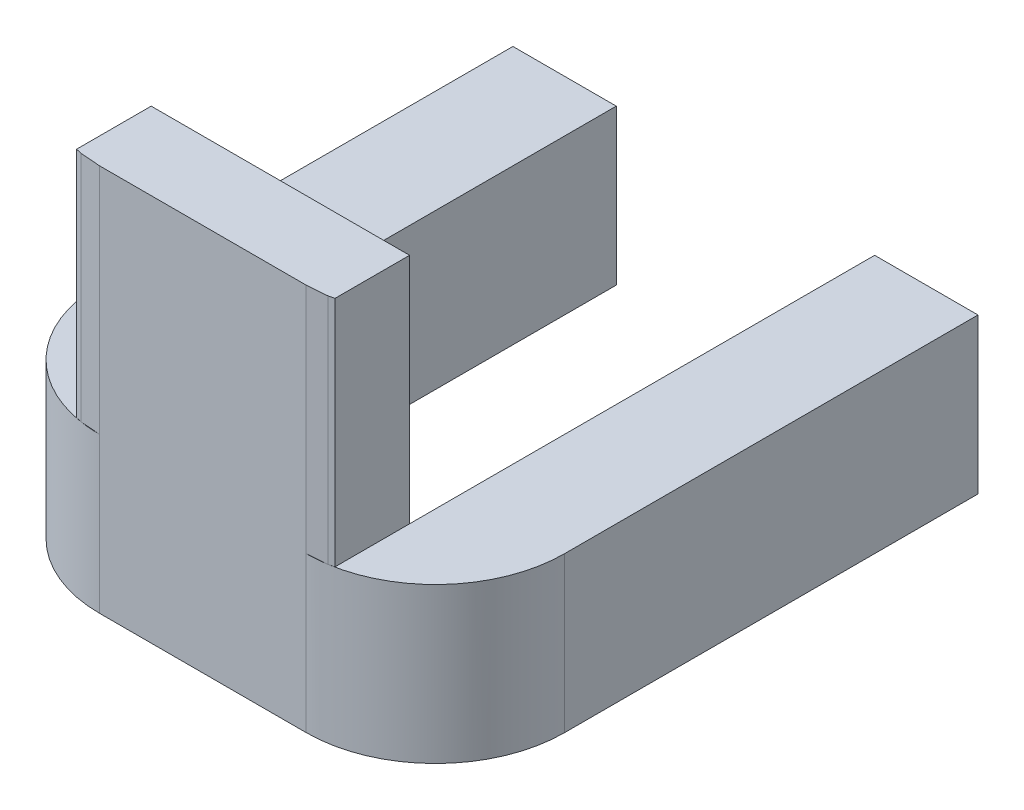
ISO-10303-21;
HEADER;
FILE_DESCRIPTION(('STEP AP214'),'2;1');
FILE_NAME('part.step','',(''),(''),'','','');
FILE_SCHEMA(('AUTOMOTIVE_DESIGN { 1 0 10303 214 1 1 1 1 }'));
ENDSEC;
DATA;
#1=APPLICATION_CONTEXT('core data for automotive mechanical design processes');
#2=APPLICATION_PROTOCOL_DEFINITION('international standard','automotive_design',2000,#1);
#3=PRODUCT_CONTEXT('',#1,'mechanical');
#4=PRODUCT('Part','Part','',(#3));
#5=PRODUCT_RELATED_PRODUCT_CATEGORY('part','',(#4));
#6=PRODUCT_DEFINITION_FORMATION('','',#4);
#7=PRODUCT_DEFINITION_CONTEXT('part definition',#1,'design');
#8=PRODUCT_DEFINITION('design','',#6,#7);
#9=PRODUCT_DEFINITION_SHAPE('','',#8);
#10=(LENGTH_UNIT() NAMED_UNIT(*) SI_UNIT(.MILLI.,.METRE.));
#11=(NAMED_UNIT(*) PLANE_ANGLE_UNIT() SI_UNIT($,.RADIAN.));
#12=(NAMED_UNIT(*) SI_UNIT($,.STERADIAN.) SOLID_ANGLE_UNIT());
#13=UNCERTAINTY_MEASURE_WITH_UNIT(LENGTH_MEASURE(1.E-05),#10,'distance_accuracy_value','');
#14=(GEOMETRIC_REPRESENTATION_CONTEXT(3) GLOBAL_UNCERTAINTY_ASSIGNED_CONTEXT((#13)) GLOBAL_UNIT_ASSIGNED_CONTEXT((#10,
#11,#12)) REPRESENTATION_CONTEXT('',''));
#15=CARTESIAN_POINT('',(0.,0.,0.));
#16=DIRECTION('',(0.,0.,1.));
#17=DIRECTION('',(1.,0.,0.));
#18=AXIS2_PLACEMENT_3D('',#15,#16,#17);
#19=CARTESIAN_POINT('',(0.,6.,0.));
#20=DIRECTION('',(0.,1.,0.));
#21=DIRECTION('',(0.,0.,1.));
#22=AXIS2_PLACEMENT_3D('',#19,#20,#21);
#23=PLANE('',#22);
#24=DIRECTION('',(0.972863824567842,0.,0.231378432113348));
#25=VECTOR('',#24,1.);
#26=CARTESIAN_POINT('',(-0.24219254130851,6.,1.01833329868782));
#27=LINE('',#26,#25);
#28=CARTESIAN_POINT('',(-5.,6.,-0.113226948788997));
#29=VERTEX_POINT('',#28);
#30=CARTESIAN_POINT('',(-4.78391078425347,6.,-0.0618339555730676));
#31=VERTEX_POINT('',#30);
#32=EDGE_CURVE('E56',#29,#31,#27,.T.);
#33=ORIENTED_EDGE('',*,*,#32,.F.);
#34=DIRECTION('',(0.,0.,-1.));
#35=VECTOR('',#34,1.);
#36=CARTESIAN_POINT('',(-5.,6.,0.));
#37=LINE('',#36,#35);
#38=CARTESIAN_POINT('',(-5.,6.,-3.));
#39=VERTEX_POINT('',#38);
#40=EDGE_CURVE('E220',#29,#39,#37,.T.);
#41=ORIENTED_EDGE('',*,*,#40,.T.);
#42=DIRECTION('',(0.,0.,-1.));
#43=VECTOR('',#42,1.);
#44=CARTESIAN_POINT('',(-5.,6.,-3.));
#45=LINE('',#44,#43);
#46=CARTESIAN_POINT('',(-5.00000000000001,6.,-21.));
#47=VERTEX_POINT('',#46);
#48=EDGE_CURVE('E238',#39,#47,#45,.T.);
#49=ORIENTED_EDGE('',*,*,#48,.T.);
#50=DIRECTION('',(-1.,0.,0.));
#51=VECTOR('',#50,1.);
#52=CARTESIAN_POINT('',(-9.00000000000001,6.,-21.));
#53=LINE('',#52,#51);
#54=CARTESIAN_POINT('',(-9.00000000000001,6.,-21.));
#55=VERTEX_POINT('',#54);
#56=EDGE_CURVE('E241',#47,#55,#53,.T.);
#57=ORIENTED_EDGE('',*,*,#56,.T.);
#58=DIRECTION('',(0.,0.,1.));
#59=VECTOR('',#58,1.);
#60=CARTESIAN_POINT('',(-9.00000000000001,6.,-21.));
#61=LINE('',#60,#59);
#62=CARTESIAN_POINT('',(-9.,6.,-5.));
#63=VERTEX_POINT('',#62);
#64=EDGE_CURVE('E243',#55,#63,#61,.T.);
#65=ORIENTED_EDGE('',*,*,#64,.T.);
#66=CARTESIAN_POINT('',(-4.,6.,-5.));
#67=DIRECTION('',(0.,1.,0.));
#68=DIRECTION('',(0.,0.,1.));
#69=AXIS2_PLACEMENT_3D('',#66,#67,#68);
#70=CIRCLE('',#69,5.);
#71=EDGE_CURVE('E300',#63,#31,#70,.T.);
#72=ORIENTED_EDGE('',*,*,#71,.T.);
#73=EDGE_LOOP('',(#33,#41,#49,#57,#65,#72));
#74=FACE_BOUND('',#73,.T.);
#75=ADVANCED_FACE('F41',(#74),#23,.T.);
#76=DIRECTION('',(0.996903508090273,0.,0.0786345697343535));
#77=VECTOR('',#76,1.);
#78=CARTESIAN_POINT('',(-0.0247335822292278,6.,0.313564313701387));
#79=LINE('',#78,#77);
#80=CARTESIAN_POINT('',(-4.,6.,0.));
#81=VERTEX_POINT('',#80);
#82=EDGE_CURVE('E197',#31,#81,#79,.T.);
#83=ORIENTED_EDGE('',*,*,#82,.F.);
#84=EDGE_CURVE('E299',#31,#81,#70,.T.);
#85=ORIENTED_EDGE('',*,*,#84,.T.);
#86=EDGE_LOOP('',(#83,#85));
#87=FACE_BOUND('',#86,.T.);
#88=ADVANCED_FACE('F330',(#87),#23,.T.);
#89=DIRECTION('',(0.,0.,-1.));
#90=VECTOR('',#89,1.);
#91=CARTESIAN_POINT('',(5.,6.,0.));
#92=LINE('',#91,#90);
#93=CARTESIAN_POINT('',(5.,6.,-0.113226948788997));
#94=VERTEX_POINT('',#93);
#95=CARTESIAN_POINT('',(5.,6.,-3.));
#96=VERTEX_POINT('',#95);
#97=EDGE_CURVE('E64',#94,#96,#92,.T.);
#98=ORIENTED_EDGE('',*,*,#97,.F.);
#99=DIRECTION('',(-0.972863824567842,0.,0.231378432113348));
#100=VECTOR('',#99,1.);
#101=CARTESIAN_POINT('',(0.24219254130851,6.,1.01833329868782));
#102=LINE('',#101,#100);
#103=CARTESIAN_POINT('',(4.78391078425343,6.,-0.0618339555730641));
#104=VERTEX_POINT('',#103);
#105=EDGE_CURVE('E218',#94,#104,#102,.T.);
#106=ORIENTED_EDGE('',*,*,#105,.T.);
#107=CARTESIAN_POINT('',(4.,6.,-5.));
#108=DIRECTION('',(0.,1.,0.));
#109=DIRECTION('',(0.,0.,1.));
#110=AXIS2_PLACEMENT_3D('',#107,#108,#109);
#111=CIRCLE('',#110,5.);
#112=CARTESIAN_POINT('',(9.,6.,-5.));
#113=VERTEX_POINT('',#112);
#114=EDGE_CURVE('E301',#104,#113,#111,.T.);
#115=ORIENTED_EDGE('',*,*,#114,.T.);
#116=DIRECTION('',(0.,0.,-1.));
#117=VECTOR('',#116,1.);
#118=CARTESIAN_POINT('',(9.,6.,-21.));
#119=LINE('',#118,#117);
#120=CARTESIAN_POINT('',(9.,6.,-21.));
#121=VERTEX_POINT('',#120);
#122=EDGE_CURVE('E246',#113,#121,#119,.T.);
#123=ORIENTED_EDGE('',*,*,#122,.T.);
#124=DIRECTION('',(-1.,0.,0.));
#125=VECTOR('',#124,1.);
#126=CARTESIAN_POINT('',(9.,6.,-21.));
#127=LINE('',#126,#125);
#128=CARTESIAN_POINT('',(5.,6.,-21.));
#129=VERTEX_POINT('',#128);
#130=EDGE_CURVE('E248',#121,#129,#127,.T.);
#131=ORIENTED_EDGE('',*,*,#130,.T.);
#132=DIRECTION('',(0.,0.,1.));
#133=VECTOR('',#132,1.);
#134=CARTESIAN_POINT('',(5.,6.,-21.));
#135=LINE('',#134,#133);
#136=EDGE_CURVE('E236',#129,#96,#135,.T.);
#137=ORIENTED_EDGE('',*,*,#136,.T.);
#138=EDGE_LOOP('',(#98,#106,#115,#123,#131,#137));
#139=FACE_BOUND('',#138,.T.);
#140=ADVANCED_FACE('F306',(#139),#23,.T.);
#141=CARTESIAN_POINT('',(5.,6.,-3.));
#142=DIRECTION('',(1.,0.,0.));
#143=DIRECTION('',(0.,0.,-1.));
#144=AXIS2_PLACEMENT_3D('',#141,#142,#143);
#145=PLANE('',#144);
#146=DIRECTION('',(0.,0.,1.));
#147=VECTOR('',#146,1.);
#148=CARTESIAN_POINT('',(5.,0.,-3.));
#149=LINE('',#148,#147);
#150=CARTESIAN_POINT('',(5.,0.,-21.));
#151=VERTEX_POINT('',#150);
#152=CARTESIAN_POINT('',(5.,0.,-3.));
#153=VERTEX_POINT('',#152);
#154=EDGE_CURVE('E227',#151,#153,#149,.T.);
#155=ORIENTED_EDGE('',*,*,#154,.T.);
#156=DIRECTION('',(0.,-1.,0.));
#157=VECTOR('',#156,1.);
#158=CARTESIAN_POINT('',(5.,6.,-3.));
#159=LINE('',#158,#157);
#160=EDGE_CURVE('E283',#96,#153,#159,.T.);
#161=ORIENTED_EDGE('',*,*,#160,.F.);
#162=ORIENTED_EDGE('',*,*,#136,.F.);
#163=DIRECTION('',(0.,-1.,0.));
#164=VECTOR('',#163,1.);
#165=CARTESIAN_POINT('',(5.,6.,-21.));
#166=LINE('',#165,#164);
#167=EDGE_CURVE('E250',#129,#151,#166,.T.);
#168=ORIENTED_EDGE('',*,*,#167,.T.);
#169=EDGE_LOOP('',(#155,#161,#162,#168));
#170=FACE_BOUND('',#169,.T.);
#171=ADVANCED_FACE('F337',(#170),#145,.F.);
#172=CARTESIAN_POINT('',(-5.,6.,-3.));
#173=DIRECTION('',(0.,0.,1.));
#174=DIRECTION('',(1.,0.,0.));
#175=AXIS2_PLACEMENT_3D('',#172,#173,#174);
#176=PLANE('',#175);
#177=DIRECTION('',(-1.,0.,0.));
#178=VECTOR('',#177,1.);
#179=CARTESIAN_POINT('',(-5.,0.,-3.));
#180=LINE('',#179,#178);
#181=CARTESIAN_POINT('',(-5.,0.,-3.));
#182=VERTEX_POINT('',#181);
#183=EDGE_CURVE('E252',#153,#182,#180,.T.);
#184=ORIENTED_EDGE('',*,*,#183,.T.);
#185=DIRECTION('',(0.,-1.,0.));
#186=VECTOR('',#185,1.);
#187=CARTESIAN_POINT('',(-5.,6.,-3.));
#188=LINE('',#187,#186);
#189=EDGE_CURVE('E280',#39,#182,#188,.T.);
#190=ORIENTED_EDGE('',*,*,#189,.F.);
#191=DIRECTION('',(0.,-1.,0.));
#192=VECTOR('',#191,1.);
#193=CARTESIAN_POINT('',(-5.,15.,-3.));
#194=LINE('',#193,#192);
#195=CARTESIAN_POINT('',(-5.,15.,-3.));
#196=VERTEX_POINT('',#195);
#197=EDGE_CURVE('E201',#196,#39,#194,.T.);
#198=ORIENTED_EDGE('',*,*,#197,.F.);
#199=DIRECTION('',(1.,0.,0.));
#200=VECTOR('',#199,1.);
#201=CARTESIAN_POINT('',(0.,15.,-3.));
#202=LINE('',#201,#200);
#203=CARTESIAN_POINT('',(5.,15.,-3.));
#204=VERTEX_POINT('',#203);
#205=EDGE_CURVE('E192',#196,#204,#202,.T.);
#206=ORIENTED_EDGE('',*,*,#205,.T.);
#207=DIRECTION('',(0.,-1.,0.));
#208=VECTOR('',#207,1.);
#209=CARTESIAN_POINT('',(5.,15.,-3.));
#210=LINE('',#209,#208);
#211=EDGE_CURVE('E198',#204,#96,#210,.T.);
#212=ORIENTED_EDGE('',*,*,#211,.T.);
#213=ORIENTED_EDGE('',*,*,#160,.T.);
#214=EDGE_LOOP('',(#184,#190,#198,#206,#212,#213));
#215=FACE_BOUND('',#214,.T.);
#216=ADVANCED_FACE('F365',(#215),#176,.F.);
#217=CARTESIAN_POINT('',(-5.00000000000001,6.,-21.));
#218=DIRECTION('',(-1.,0.,0.));
#219=DIRECTION('',(0.,0.,1.));
#220=AXIS2_PLACEMENT_3D('',#217,#218,#219);
#221=PLANE('',#220);
#222=DIRECTION('',(0.,0.,-1.));
#223=VECTOR('',#222,1.);
#224=CARTESIAN_POINT('',(-5.00000000000001,0.,-21.));
#225=LINE('',#224,#223);
#226=CARTESIAN_POINT('',(-5.00000000000001,0.,-21.));
#227=VERTEX_POINT('',#226);
#228=EDGE_CURVE('E255',#182,#227,#225,.T.);
#229=ORIENTED_EDGE('',*,*,#228,.T.);
#230=DIRECTION('',(0.,-1.,0.));
#231=VECTOR('',#230,1.);
#232=CARTESIAN_POINT('',(-5.00000000000001,6.,-21.));
#233=LINE('',#232,#231);
#234=EDGE_CURVE('E277',#47,#227,#233,.T.);
#235=ORIENTED_EDGE('',*,*,#234,.F.);
#236=ORIENTED_EDGE('',*,*,#48,.F.);
#237=ORIENTED_EDGE('',*,*,#189,.T.);
#238=EDGE_LOOP('',(#229,#235,#236,#237));
#239=FACE_BOUND('',#238,.T.);
#240=ADVANCED_FACE('F361',(#239),#221,.F.);
#241=CARTESIAN_POINT('',(-9.00000000000001,6.,-21.));
#242=DIRECTION('',(0.,0.,1.));
#243=DIRECTION('',(1.,0.,0.));
#244=AXIS2_PLACEMENT_3D('',#241,#242,#243);
#245=PLANE('',#244);
#246=CARTESIAN_POINT('',(-7.,3.,-21.));
#247=DIRECTION('',(0.,0.,-1.));
#248=DIRECTION('',(-1.,0.,0.));
#249=AXIS2_PLACEMENT_3D('',#246,#247,#248);
#250=CIRCLE('',#249,1.5);
#251=CARTESIAN_POINT('',(-8.5,3.,-21.));
#252=VERTEX_POINT('',#251);
#253=EDGE_CURVE('E228',#252,#252,#250,.T.);
#254=ORIENTED_EDGE('',*,*,#253,.F.);
#255=EDGE_LOOP('',(#254));
#256=FACE_BOUND('',#255,.T.);
#257=DIRECTION('',(-1.,0.,0.));
#258=VECTOR('',#257,1.);
#259=CARTESIAN_POINT('',(-9.00000000000001,0.,-21.));
#260=LINE('',#259,#258);
#261=CARTESIAN_POINT('',(-9.00000000000001,0.,-21.));
#262=VERTEX_POINT('',#261);
#263=EDGE_CURVE('E257',#227,#262,#260,.T.);
#264=ORIENTED_EDGE('',*,*,#263,.T.);
#265=DIRECTION('',(0.,-1.,0.));
#266=VECTOR('',#265,1.);
#267=CARTESIAN_POINT('',(-9.00000000000001,6.,-21.));
#268=LINE('',#267,#266);
#269=EDGE_CURVE('E274',#55,#262,#268,.T.);
#270=ORIENTED_EDGE('',*,*,#269,.F.);
#271=ORIENTED_EDGE('',*,*,#56,.F.);
#272=ORIENTED_EDGE('',*,*,#234,.T.);
#273=EDGE_LOOP('',(#264,#270,#271,#272));
#274=FACE_BOUND('',#273,.T.);
#275=ADVANCED_FACE('F357',(#256,#274),#245,.F.);
#276=CARTESIAN_POINT('',(-9.00000000000001,6.,-21.));
#277=DIRECTION('',(1.,0.,0.));
#278=DIRECTION('',(0.,0.,-1.));
#279=AXIS2_PLACEMENT_3D('',#276,#277,#278);
#280=PLANE('',#279);
#281=DIRECTION('',(0.,0.,1.));
#282=VECTOR('',#281,1.);
#283=CARTESIAN_POINT('',(-9.00000000000001,0.,-21.));
#284=LINE('',#283,#282);
#285=CARTESIAN_POINT('',(-9.,0.,-5.));
#286=VERTEX_POINT('',#285);
#287=EDGE_CURVE('E259',#262,#286,#284,.T.);
#288=ORIENTED_EDGE('',*,*,#287,.T.);
#289=DIRECTION('',(0.,-1.,0.));
#290=VECTOR('',#289,1.);
#291=CARTESIAN_POINT('',(-9.,6.,-5.));
#292=LINE('',#291,#290);
#293=EDGE_CURVE('E11',#286,#63,#292,.F.);
#294=ORIENTED_EDGE('',*,*,#293,.T.);
#295=ORIENTED_EDGE('',*,*,#64,.F.);
#296=ORIENTED_EDGE('',*,*,#269,.T.);
#297=EDGE_LOOP('',(#288,#294,#295,#296));
#298=FACE_BOUND('',#297,.T.);
#299=ADVANCED_FACE('F354',(#298),#280,.F.);
#300=CARTESIAN_POINT('',(9.,6.,0.));
#301=DIRECTION('',(0.,0.,-1.));
#302=DIRECTION('',(-1.,0.,0.));
#303=AXIS2_PLACEMENT_3D('',#300,#301,#302);
#304=PLANE('',#303);
#305=DIRECTION('',(1.,0.,0.));
#306=VECTOR('',#305,1.);
#307=CARTESIAN_POINT('',(9.,0.,0.));
#308=LINE('',#307,#306);
#309=CARTESIAN_POINT('',(-4.,0.,0.));
#310=VERTEX_POINT('',#309);
#311=CARTESIAN_POINT('',(4.,0.,0.));
#312=VERTEX_POINT('',#311);
#313=EDGE_CURVE('E262',#310,#312,#308,.T.);
#314=ORIENTED_EDGE('',*,*,#313,.T.);
#315=DIRECTION('',(0.,-1.,0.));
#316=VECTOR('',#315,1.);
#317=CARTESIAN_POINT('',(4.,6.,0.));
#318=LINE('',#317,#316);
#319=CARTESIAN_POINT('',(4.,6.,0.));
#320=VERTEX_POINT('',#319);
#321=EDGE_CURVE('E296',#312,#320,#318,.F.);
#322=ORIENTED_EDGE('',*,*,#321,.T.);
#323=DIRECTION('',(0.,-1.,0.));
#324=VECTOR('',#323,1.);
#325=CARTESIAN_POINT('',(4.,15.,0.));
#326=LINE('',#325,#324);
#327=CARTESIAN_POINT('',(4.,15.,0.));
#328=VERTEX_POINT('',#327);
#329=EDGE_CURVE('E164',#328,#320,#326,.T.);
#330=ORIENTED_EDGE('',*,*,#329,.F.);
#331=DIRECTION('',(-1.,0.,0.));
#332=VECTOR('',#331,1.);
#333=CARTESIAN_POINT('',(0.,15.,0.));
#334=LINE('',#333,#332);
#335=CARTESIAN_POINT('',(-4.,15.,0.));
#336=VERTEX_POINT('',#335);
#337=EDGE_CURVE('E180',#328,#336,#334,.T.);
#338=ORIENTED_EDGE('',*,*,#337,.T.);
#339=DIRECTION('',(0.,-1.,0.));
#340=VECTOR('',#339,1.);
#341=CARTESIAN_POINT('',(-4.,15.,0.));
#342=LINE('',#341,#340);
#343=EDGE_CURVE('E210',#336,#81,#342,.T.);
#344=ORIENTED_EDGE('',*,*,#343,.T.);
#345=DIRECTION('',(0.,-1.,0.));
#346=VECTOR('',#345,1.);
#347=CARTESIAN_POINT('',(-4.,6.,0.));
#348=LINE('',#347,#346);
#349=EDGE_CURVE('E293',#81,#310,#348,.T.);
#350=ORIENTED_EDGE('',*,*,#349,.T.);
#351=EDGE_LOOP('',(#314,#322,#330,#338,#344,#350));
#352=FACE_BOUND('',#351,.T.);
#353=ADVANCED_FACE('F321',(#352),#304,.F.);
#354=CARTESIAN_POINT('',(9.,6.,-21.));
#355=DIRECTION('',(-1.,0.,0.));
#356=DIRECTION('',(0.,0.,1.));
#357=AXIS2_PLACEMENT_3D('',#354,#355,#356);
#358=PLANE('',#357);
#359=ORIENTED_EDGE('',*,*,#122,.F.);
#360=DIRECTION('',(0.,-1.,0.));
#361=VECTOR('',#360,1.);
#362=CARTESIAN_POINT('',(9.,6.,-5.));
#363=LINE('',#362,#361);
#364=CARTESIAN_POINT('',(9.,0.,-5.));
#365=VERTEX_POINT('',#364);
#366=EDGE_CURVE('E286',#113,#365,#363,.T.);
#367=ORIENTED_EDGE('',*,*,#366,.T.);
#368=DIRECTION('',(0.,0.,-1.));
#369=VECTOR('',#368,1.);
#370=CARTESIAN_POINT('',(9.,0.,-21.));
#371=LINE('',#370,#369);
#372=CARTESIAN_POINT('',(9.,0.,-21.));
#373=VERTEX_POINT('',#372);
#374=EDGE_CURVE('E265',#365,#373,#371,.T.);
#375=ORIENTED_EDGE('',*,*,#374,.T.);
#376=DIRECTION('',(0.,-1.,0.));
#377=VECTOR('',#376,1.);
#378=CARTESIAN_POINT('',(9.,6.,-21.));
#379=LINE('',#378,#377);
#380=EDGE_CURVE('E271',#121,#373,#379,.T.);
#381=ORIENTED_EDGE('',*,*,#380,.F.);
#382=EDGE_LOOP('',(#359,#367,#375,#381));
#383=FACE_BOUND('',#382,.T.);
#384=ADVANCED_FACE('F311',(#383),#358,.F.);
#385=CARTESIAN_POINT('',(9.,6.,-21.));
#386=DIRECTION('',(0.,0.,1.));
#387=DIRECTION('',(1.,0.,0.));
#388=AXIS2_PLACEMENT_3D('',#385,#386,#387);
#389=PLANE('',#388);
#390=CARTESIAN_POINT('',(6.99999999999997,3.,-21.));
#391=DIRECTION('',(0.,0.,-1.));
#392=DIRECTION('',(1.,0.,0.));
#393=AXIS2_PLACEMENT_3D('',#390,#391,#392);
#394=CIRCLE('',#393,1.5);
#395=CARTESIAN_POINT('',(8.49999999999997,3.,-21.));
#396=VERTEX_POINT('',#395);
#397=EDGE_CURVE('E223',#396,#396,#394,.T.);
#398=ORIENTED_EDGE('',*,*,#397,.F.);
#399=EDGE_LOOP('',(#398));
#400=FACE_BOUND('',#399,.T.);
#401=DIRECTION('',(-1.,0.,0.));
#402=VECTOR('',#401,1.);
#403=CARTESIAN_POINT('',(9.,0.,-21.));
#404=LINE('',#403,#402);
#405=EDGE_CURVE('E239',#373,#151,#404,.T.);
#406=ORIENTED_EDGE('',*,*,#405,.T.);
#407=ORIENTED_EDGE('',*,*,#167,.F.);
#408=ORIENTED_EDGE('',*,*,#130,.F.);
#409=ORIENTED_EDGE('',*,*,#380,.T.);
#410=EDGE_LOOP('',(#406,#407,#408,#409));
#411=FACE_BOUND('',#410,.T.);
#412=ADVANCED_FACE('F342',(#400,#411),#389,.F.);
#413=DIRECTION('',(0.996903508090273,0.,-0.0786345697343525));
#414=VECTOR('',#413,1.);
#415=CARTESIAN_POINT('',(0.024733582229227,6.,0.313564313701382));
#416=LINE('',#415,#414);
#417=EDGE_CURVE('E162',#320,#104,#416,.T.);
#418=ORIENTED_EDGE('',*,*,#417,.F.);
#419=EDGE_CURVE('E49',#320,#104,#111,.T.);
#420=ORIENTED_EDGE('',*,*,#419,.T.);
#421=EDGE_LOOP('',(#418,#420));
#422=FACE_BOUND('',#421,.T.);
#423=ADVANCED_FACE('F338',(#422),#23,.T.);
#424=CARTESIAN_POINT('',(0.,0.,0.));
#425=DIRECTION('',(0.,1.,0.));
#426=DIRECTION('',(0.,0.,1.));
#427=AXIS2_PLACEMENT_3D('',#424,#425,#426);
#428=PLANE('',#427);
#429=CARTESIAN_POINT('',(4.,0.,-5.));
#430=DIRECTION('',(0.,1.,0.));
#431=DIRECTION('',(0.,0.,1.));
#432=AXIS2_PLACEMENT_3D('',#429,#430,#431);
#433=CIRCLE('',#432,5.);
#434=EDGE_CURVE('E291',#365,#312,#433,.F.);
#435=ORIENTED_EDGE('',*,*,#434,.T.);
#436=ORIENTED_EDGE('',*,*,#313,.F.);
#437=CARTESIAN_POINT('',(-4.,0.,-5.));
#438=DIRECTION('',(0.,1.,0.));
#439=DIRECTION('',(0.,0.,1.));
#440=AXIS2_PLACEMENT_3D('',#437,#438,#439);
#441=CIRCLE('',#440,5.);
#442=EDGE_CURVE('E289',#310,#286,#441,.F.);
#443=ORIENTED_EDGE('',*,*,#442,.T.);
#444=ORIENTED_EDGE('',*,*,#287,.F.);
#445=ORIENTED_EDGE('',*,*,#263,.F.);
#446=ORIENTED_EDGE('',*,*,#228,.F.);
#447=ORIENTED_EDGE('',*,*,#183,.F.);
#448=ORIENTED_EDGE('',*,*,#154,.F.);
#449=ORIENTED_EDGE('',*,*,#405,.F.);
#450=ORIENTED_EDGE('',*,*,#374,.F.);
#451=EDGE_LOOP('',(#435,#436,#443,#444,#445,#446,#447,#448,#449,#450));
#452=FACE_BOUND('',#451,.T.);
#453=ADVANCED_FACE('F318',(#452),#428,.F.);
#454=CARTESIAN_POINT('',(6.99999999999997,3.,-17.));
#455=DIRECTION('',(0.,0.,-1.));
#456=DIRECTION('',(-1.,0.,0.));
#457=AXIS2_PLACEMENT_3D('',#454,#455,#456);
#458=CYLINDRICAL_SURFACE('',#457,1.5);
#459=CARTESIAN_POINT('',(6.99999999999997,3.,-17.));
#460=DIRECTION('',(0.,0.,-1.));
#461=DIRECTION('',(1.,0.,0.));
#462=AXIS2_PLACEMENT_3D('',#459,#460,#461);
#463=CIRCLE('',#462,1.5);
#464=CARTESIAN_POINT('',(8.49999999999997,3.,-17.));
#465=VERTEX_POINT('',#464);
#466=EDGE_CURVE('E231',#465,#465,#463,.T.);
#467=ORIENTED_EDGE('',*,*,#466,.F.);
#468=EDGE_LOOP('',(#467));
#469=FACE_BOUND('',#468,.T.);
#470=ORIENTED_EDGE('',*,*,#397,.T.);
#471=EDGE_LOOP('',(#470));
#472=FACE_BOUND('',#471,.T.);
#473=ADVANCED_FACE('F343',(#469,#472),#458,.F.);
#474=CARTESIAN_POINT('',(6.99999999999997,3.,-17.));
#475=DIRECTION('',(0.,0.,1.));
#476=DIRECTION('',(1.,0.,0.));
#477=AXIS2_PLACEMENT_3D('',#474,#475,#476);
#478=PLANE('',#477);
#479=ORIENTED_EDGE('',*,*,#466,.T.);
#480=EDGE_LOOP('',(#479));
#481=FACE_BOUND('',#480,.T.);
#482=ADVANCED_FACE('F384',(#481),#478,.F.);
#483=CARTESIAN_POINT('',(-7.,3.,-17.));
#484=DIRECTION('',(0.,0.,-1.));
#485=DIRECTION('',(-1.,0.,0.));
#486=AXIS2_PLACEMENT_3D('',#483,#484,#485);
#487=CYLINDRICAL_SURFACE('',#486,1.5);
#488=CARTESIAN_POINT('',(-7.,3.,-17.));
#489=DIRECTION('',(0.,0.,-1.));
#490=DIRECTION('',(-1.,0.,0.));
#491=AXIS2_PLACEMENT_3D('',#488,#489,#490);
#492=CIRCLE('',#491,1.5);
#493=CARTESIAN_POINT('',(-8.5,3.,-17.));
#494=VERTEX_POINT('',#493);
#495=EDGE_CURVE('E224',#494,#494,#492,.T.);
#496=ORIENTED_EDGE('',*,*,#495,.F.);
#497=EDGE_LOOP('',(#496));
#498=FACE_BOUND('',#497,.T.);
#499=ORIENTED_EDGE('',*,*,#253,.T.);
#500=EDGE_LOOP('',(#499));
#501=FACE_BOUND('',#500,.T.);
#502=ADVANCED_FACE('F378',(#498,#501),#487,.F.);
#503=CARTESIAN_POINT('',(-7.,3.,-17.));
#504=DIRECTION('',(0.,0.,-1.));
#505=DIRECTION('',(-1.,0.,0.));
#506=AXIS2_PLACEMENT_3D('',#503,#504,#505);
#507=PLANE('',#506);
#508=ORIENTED_EDGE('',*,*,#495,.T.);
#509=EDGE_LOOP('',(#508));
#510=FACE_BOUND('',#509,.T.);
#511=ADVANCED_FACE('F373',(#510),#507,.T.);
#512=CARTESIAN_POINT('',(4.,6.,-5.));
#513=DIRECTION('',(0.,-1.,0.));
#514=DIRECTION('',(0.,0.,-1.));
#515=AXIS2_PLACEMENT_3D('',#512,#513,#514);
#516=CYLINDRICAL_SURFACE('',#515,5.);
#517=ORIENTED_EDGE('',*,*,#321,.F.);
#518=ORIENTED_EDGE('',*,*,#434,.F.);
#519=ORIENTED_EDGE('',*,*,#366,.F.);
#520=ORIENTED_EDGE('',*,*,#114,.F.);
#521=ORIENTED_EDGE('',*,*,#419,.F.);
#522=EDGE_LOOP('',(#517,#518,#519,#520,#521));
#523=FACE_BOUND('',#522,.T.);
#524=ADVANCED_FACE('F315',(#523),#516,.T.);
#525=CARTESIAN_POINT('',(-4.,6.,-5.));
#526=DIRECTION('',(0.,-1.,0.));
#527=DIRECTION('',(0.,0.,-1.));
#528=AXIS2_PLACEMENT_3D('',#525,#526,#527);
#529=CYLINDRICAL_SURFACE('',#528,5.);
#530=ORIENTED_EDGE('',*,*,#84,.F.);
#531=ORIENTED_EDGE('',*,*,#71,.F.);
#532=ORIENTED_EDGE('',*,*,#293,.F.);
#533=ORIENTED_EDGE('',*,*,#442,.F.);
#534=ORIENTED_EDGE('',*,*,#349,.F.);
#535=EDGE_LOOP('',(#530,#531,#532,#533,#534));
#536=FACE_BOUND('',#535,.T.);
#537=ADVANCED_FACE('F43',(#536),#529,.T.);
#538=CARTESIAN_POINT('',(0.24219254130851,15.,1.01833329868782));
#539=DIRECTION('',(-0.231378432113348,0.,-0.972863824567842));
#540=DIRECTION('',(-0.972863824567842,0.,0.231378432113348));
#541=AXIS2_PLACEMENT_3D('',#538,#539,#540);
#542=PLANE('',#541);
#543=ORIENTED_EDGE('',*,*,#105,.F.);
#544=DIRECTION('',(0.,-1.,0.));
#545=VECTOR('',#544,1.);
#546=CARTESIAN_POINT('',(5.,15.,-0.113226948788997));
#547=LINE('',#546,#545);
#548=CARTESIAN_POINT('',(5.,15.,-0.113226948788997));
#549=VERTEX_POINT('',#548);
#550=EDGE_CURVE('E171',#549,#94,#547,.T.);
#551=ORIENTED_EDGE('',*,*,#550,.F.);
#552=DIRECTION('',(0.972863824567842,0.,-0.231378432113348));
#553=VECTOR('',#552,1.);
#554=CARTESIAN_POINT('',(0.24219254130851,15.,1.01833329868782));
#555=LINE('',#554,#553);
#556=CARTESIAN_POINT('',(4.78391078425343,15.,-0.0618339555730641));
#557=VERTEX_POINT('',#556);
#558=EDGE_CURVE('E168',#557,#549,#555,.T.);
#559=ORIENTED_EDGE('',*,*,#558,.F.);
#560=DIRECTION('',(0.,-1.,0.));
#561=VECTOR('',#560,1.);
#562=CARTESIAN_POINT('',(4.78391078425343,15.,-0.0618339555730641));
#563=LINE('',#562,#561);
#564=EDGE_CURVE('E156',#557,#104,#563,.T.);
#565=ORIENTED_EDGE('',*,*,#564,.T.);
#566=EDGE_LOOP('',(#543,#551,#559,#565));
#567=FACE_BOUND('',#566,.T.);
#568=ADVANCED_FACE('F169',(#567),#542,.F.);
#569=CARTESIAN_POINT('',(5.,15.,0.));
#570=DIRECTION('',(1.,0.,0.));
#571=DIRECTION('',(0.,0.,-1.));
#572=AXIS2_PLACEMENT_3D('',#569,#570,#571);
#573=PLANE('',#572);
#574=ORIENTED_EDGE('',*,*,#550,.T.);
#575=ORIENTED_EDGE('',*,*,#97,.T.);
#576=ORIENTED_EDGE('',*,*,#211,.F.);
#577=DIRECTION('',(0.,0.,1.));
#578=VECTOR('',#577,1.);
#579=CARTESIAN_POINT('',(5.,15.,0.));
#580=LINE('',#579,#578);
#581=EDGE_CURVE('E165',#204,#549,#580,.T.);
#582=ORIENTED_EDGE('',*,*,#581,.T.);
#583=EDGE_LOOP('',(#574,#575,#576,#582));
#584=FACE_BOUND('',#583,.T.);
#585=ADVANCED_FACE('F404',(#584),#573,.T.);
#586=CARTESIAN_POINT('',(-5.,15.,0.));
#587=DIRECTION('',(1.,0.,0.));
#588=DIRECTION('',(0.,0.,-1.));
#589=AXIS2_PLACEMENT_3D('',#586,#587,#588);
#590=PLANE('',#589);
#591=ORIENTED_EDGE('',*,*,#40,.F.);
#592=DIRECTION('',(0.,-1.,0.));
#593=VECTOR('',#592,1.);
#594=CARTESIAN_POINT('',(-5.,15.,-0.113226948788997));
#595=LINE('',#594,#593);
#596=CARTESIAN_POINT('',(-5.,15.,-0.113226948788997));
#597=VERTEX_POINT('',#596);
#598=EDGE_CURVE('E204',#597,#29,#595,.T.);
#599=ORIENTED_EDGE('',*,*,#598,.F.);
#600=DIRECTION('',(0.,0.,1.));
#601=VECTOR('',#600,1.);
#602=CARTESIAN_POINT('',(-5.,15.,0.));
#603=LINE('',#602,#601);
#604=EDGE_CURVE('E190',#196,#597,#603,.T.);
#605=ORIENTED_EDGE('',*,*,#604,.F.);
#606=ORIENTED_EDGE('',*,*,#197,.T.);
#607=EDGE_LOOP('',(#591,#599,#605,#606));
#608=FACE_BOUND('',#607,.T.);
#609=ADVANCED_FACE('F411',(#608),#590,.F.);
#610=CARTESIAN_POINT('',(-0.24219254130851,15.,1.01833329868782));
#611=DIRECTION('',(-0.231378432113348,0.,0.972863824567842));
#612=DIRECTION('',(0.972863824567842,0.,0.231378432113348));
#613=AXIS2_PLACEMENT_3D('',#610,#611,#612);
#614=PLANE('',#613);
#615=ORIENTED_EDGE('',*,*,#598,.T.);
#616=ORIENTED_EDGE('',*,*,#32,.T.);
#617=DIRECTION('',(0.,-1.,0.));
#618=VECTOR('',#617,1.);
#619=CARTESIAN_POINT('',(-4.78391078425347,15.,-0.0618339555730677));
#620=LINE('',#619,#618);
#621=CARTESIAN_POINT('',(-4.78391078425347,15.,-0.0618339555730677));
#622=VERTEX_POINT('',#621);
#623=EDGE_CURVE('E207',#622,#31,#620,.T.);
#624=ORIENTED_EDGE('',*,*,#623,.F.);
#625=DIRECTION('',(-0.972863824567842,0.,-0.231378432113348));
#626=VECTOR('',#625,1.);
#627=CARTESIAN_POINT('',(-0.24219254130851,15.,1.01833329868782));
#628=LINE('',#627,#626);
#629=EDGE_CURVE('E187',#622,#597,#628,.T.);
#630=ORIENTED_EDGE('',*,*,#629,.T.);
#631=EDGE_LOOP('',(#615,#616,#624,#630));
#632=FACE_BOUND('',#631,.T.);
#633=ADVANCED_FACE('F413',(#632),#614,.T.);
#634=CARTESIAN_POINT('',(-0.0247335822292278,15.,0.313564313701387));
#635=DIRECTION('',(-0.0786345697343535,0.,0.996903508090273));
#636=DIRECTION('',(0.996903508090273,0.,0.0786345697343535));
#637=AXIS2_PLACEMENT_3D('',#634,#635,#636);
#638=PLANE('',#637);
#639=ORIENTED_EDGE('',*,*,#623,.T.);
#640=ORIENTED_EDGE('',*,*,#82,.T.);
#641=ORIENTED_EDGE('',*,*,#343,.F.);
#642=DIRECTION('',(-0.996903508090273,0.,-0.0786345697343535));
#643=VECTOR('',#642,1.);
#644=CARTESIAN_POINT('',(-0.0247335822292278,15.,0.313564313701387));
#645=LINE('',#644,#643);
#646=EDGE_CURVE('E182',#336,#622,#645,.T.);
#647=ORIENTED_EDGE('',*,*,#646,.T.);
#648=EDGE_LOOP('',(#639,#640,#641,#647));
#649=FACE_BOUND('',#648,.T.);
#650=ADVANCED_FACE('F328',(#649),#638,.T.);
#651=CARTESIAN_POINT('',(0.024733582229227,15.,0.313564313701382));
#652=DIRECTION('',(0.0786345697343524,0.,0.996903508090273));
#653=DIRECTION('',(0.996903508090273,0.,-0.0786345697343525));
#654=AXIS2_PLACEMENT_3D('',#651,#652,#653);
#655=PLANE('',#654);
#656=ORIENTED_EDGE('',*,*,#329,.T.);
#657=ORIENTED_EDGE('',*,*,#417,.T.);
#658=ORIENTED_EDGE('',*,*,#564,.F.);
#659=DIRECTION('',(-0.996903508090273,0.,0.0786345697343525));
#660=VECTOR('',#659,1.);
#661=CARTESIAN_POINT('',(0.024733582229227,15.,0.313564313701382));
#662=LINE('',#661,#660);
#663=EDGE_CURVE('E161',#557,#328,#662,.T.);
#664=ORIENTED_EDGE('',*,*,#663,.T.);
#665=EDGE_LOOP('',(#656,#657,#658,#664));
#666=FACE_BOUND('',#665,.T.);
#667=ADVANCED_FACE('F159',(#666),#655,.T.);
#668=CARTESIAN_POINT('',(0.,15.,0.));
#669=DIRECTION('',(0.,-1.,0.));
#670=DIRECTION('',(0.,0.,-1.));
#671=AXIS2_PLACEMENT_3D('',#668,#669,#670);
#672=PLANE('',#671);
#673=ORIENTED_EDGE('',*,*,#558,.T.);
#674=ORIENTED_EDGE('',*,*,#581,.F.);
#675=ORIENTED_EDGE('',*,*,#205,.F.);
#676=ORIENTED_EDGE('',*,*,#604,.T.);
#677=ORIENTED_EDGE('',*,*,#629,.F.);
#678=ORIENTED_EDGE('',*,*,#646,.F.);
#679=ORIENTED_EDGE('',*,*,#337,.F.);
#680=ORIENTED_EDGE('',*,*,#663,.F.);
#681=EDGE_LOOP('',(#673,#674,#675,#676,#677,#678,#679,#680));
#682=FACE_BOUND('',#681,.T.);
#683=ADVANCED_FACE('F177',(#682),#672,.F.);
#684=CLOSED_SHELL('',(#75,#88,#140,#171,#216,#240,#275,#299,#353,#384,#412,#423,#453,#473,#482,
#502,#511,#524,#537,#568,#585,#609,#633,#650,#667,#683));
#685=MANIFOLD_SOLID_BREP('B2',#684);
#686=ADVANCED_BREP_SHAPE_REPRESENTATION('',(#18,#685),#14);
#687=SHAPE_DEFINITION_REPRESENTATION(#9,#686);
ENDSEC;
END-ISO-10303-21;
